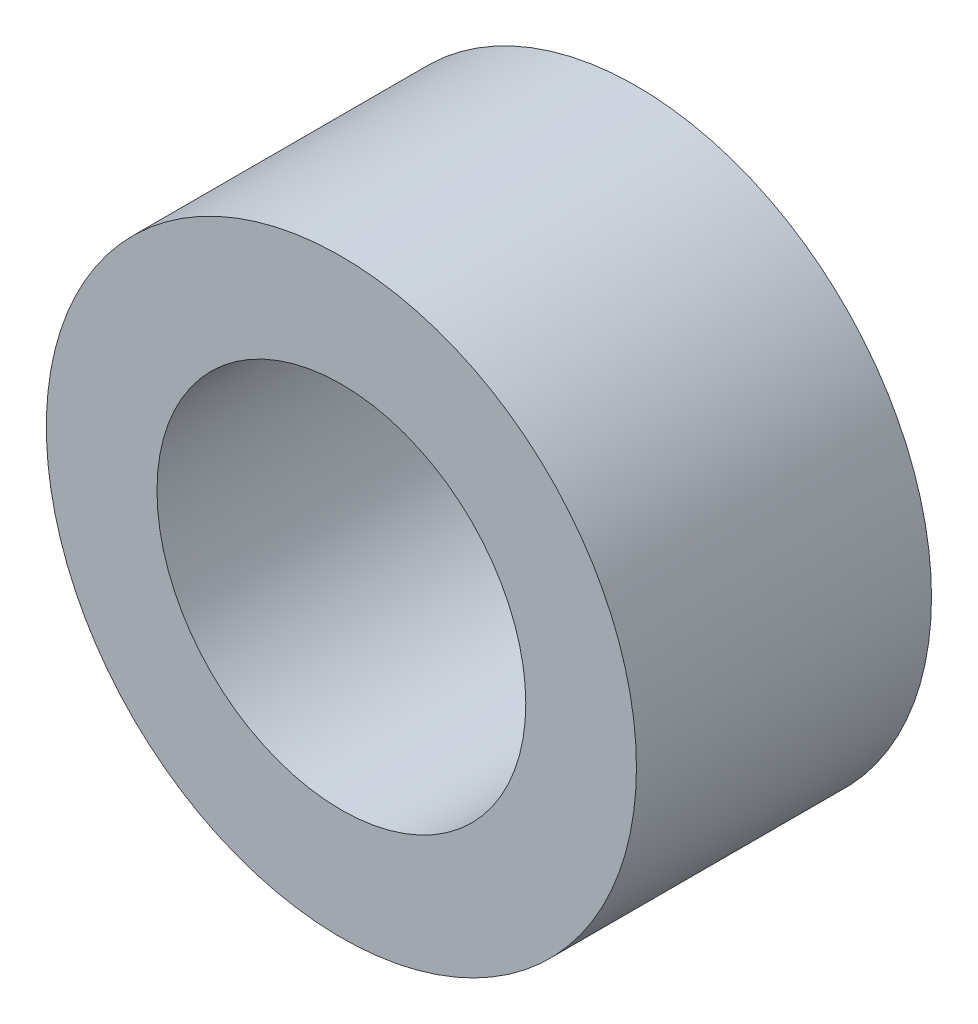
ISO-10303-21;
HEADER;
FILE_DESCRIPTION(('STEP AP214'),'2;1');
FILE_NAME('part.step','',(''),(''),'','','');
FILE_SCHEMA(('AUTOMOTIVE_DESIGN { 1 0 10303 214 1 1 1 1 }'));
ENDSEC;
DATA;
#1=APPLICATION_CONTEXT('core data for automotive mechanical design processes');
#2=APPLICATION_PROTOCOL_DEFINITION('international standard','automotive_design',2000,#1);
#3=PRODUCT_CONTEXT('',#1,'mechanical');
#4=PRODUCT('Part','Part','',(#3));
#5=PRODUCT_RELATED_PRODUCT_CATEGORY('part','',(#4));
#6=PRODUCT_DEFINITION_FORMATION('','',#4);
#7=PRODUCT_DEFINITION_CONTEXT('part definition',#1,'design');
#8=PRODUCT_DEFINITION('design','',#6,#7);
#9=PRODUCT_DEFINITION_SHAPE('','',#8);
#10=(LENGTH_UNIT() NAMED_UNIT(*) SI_UNIT(.MILLI.,.METRE.));
#11=(NAMED_UNIT(*) PLANE_ANGLE_UNIT() SI_UNIT($,.RADIAN.));
#12=(NAMED_UNIT(*) SI_UNIT($,.STERADIAN.) SOLID_ANGLE_UNIT());
#13=UNCERTAINTY_MEASURE_WITH_UNIT(LENGTH_MEASURE(1.E-05),#10,'distance_accuracy_value','');
#14=(GEOMETRIC_REPRESENTATION_CONTEXT(3) GLOBAL_UNCERTAINTY_ASSIGNED_CONTEXT((#13)) GLOBAL_UNIT_ASSIGNED_CONTEXT((#10,
#11,#12)) REPRESENTATION_CONTEXT('',''));
#15=CARTESIAN_POINT('',(0.,0.,0.));
#16=DIRECTION('',(0.,0.,1.));
#17=DIRECTION('',(1.,0.,0.));
#18=AXIS2_PLACEMENT_3D('',#15,#16,#17);
#19=CARTESIAN_POINT('',(0.,0.,5.));
#20=DIRECTION('',(0.,0.,1.));
#21=DIRECTION('',(1.,0.,0.));
#22=AXIS2_PLACEMENT_3D('',#19,#20,#21);
#23=PLANE('',#22);
#24=CARTESIAN_POINT('',(0.,0.,5.));
#25=DIRECTION('',(0.,0.,1.));
#26=DIRECTION('',(1.,0.,0.));
#27=AXIS2_PLACEMENT_3D('',#24,#25,#26);
#28=CIRCLE('',#27,5.);
#29=CARTESIAN_POINT('',(5.,0.,5.));
#30=VERTEX_POINT('',#29);
#31=EDGE_CURVE('E10',#30,#30,#28,.T.);
#32=ORIENTED_EDGE('',*,*,#31,.T.);
#33=EDGE_LOOP('',(#32));
#34=FACE_BOUND('',#33,.T.);
#35=CARTESIAN_POINT('',(0.,0.,5.));
#36=DIRECTION('',(0.,0.,1.));
#37=DIRECTION('',(1.,0.,0.));
#38=AXIS2_PLACEMENT_3D('',#35,#36,#37);
#39=CIRCLE('',#38,3.125);
#40=CARTESIAN_POINT('',(3.125,0.,5.));
#41=VERTEX_POINT('',#40);
#42=EDGE_CURVE('E42',#41,#41,#39,.T.);
#43=ORIENTED_EDGE('',*,*,#42,.F.);
#44=EDGE_LOOP('',(#43));
#45=FACE_BOUND('',#44,.T.);
#46=ADVANCED_FACE('F31',(#34,#45),#23,.T.);
#47=CARTESIAN_POINT('',(0.,0.,0.));
#48=DIRECTION('',(0.,0.,1.));
#49=DIRECTION('',(1.,0.,0.));
#50=AXIS2_PLACEMENT_3D('',#47,#48,#49);
#51=PLANE('',#50);
#52=CARTESIAN_POINT('',(0.,0.,0.));
#53=DIRECTION('',(0.,0.,1.));
#54=DIRECTION('',(1.,0.,0.));
#55=AXIS2_PLACEMENT_3D('',#52,#53,#54);
#56=CIRCLE('',#55,5.);
#57=CARTESIAN_POINT('',(5.,0.,0.));
#58=VERTEX_POINT('',#57);
#59=EDGE_CURVE('E35',#58,#58,#56,.T.);
#60=ORIENTED_EDGE('',*,*,#59,.F.);
#61=EDGE_LOOP('',(#60));
#62=FACE_BOUND('',#61,.T.);
#63=CARTESIAN_POINT('',(0.,0.,0.));
#64=DIRECTION('',(0.,0.,1.));
#65=DIRECTION('',(1.,0.,0.));
#66=AXIS2_PLACEMENT_3D('',#63,#64,#65);
#67=CIRCLE('',#66,3.125);
#68=CARTESIAN_POINT('',(3.125,0.,0.));
#69=VERTEX_POINT('',#68);
#70=EDGE_CURVE('E44',#69,#69,#67,.T.);
#71=ORIENTED_EDGE('',*,*,#70,.T.);
#72=EDGE_LOOP('',(#71));
#73=FACE_BOUND('',#72,.T.);
#74=ADVANCED_FACE('F54',(#62,#73),#51,.F.);
#75=CARTESIAN_POINT('',(0.,0.,5.));
#76=DIRECTION('',(0.,0.,-1.));
#77=DIRECTION('',(-1.,0.,0.));
#78=AXIS2_PLACEMENT_3D('',#75,#76,#77);
#79=CYLINDRICAL_SURFACE('',#78,5.);
#80=ORIENTED_EDGE('',*,*,#31,.F.);
#81=EDGE_LOOP('',(#80));
#82=FACE_BOUND('',#81,.T.);
#83=ORIENTED_EDGE('',*,*,#59,.T.);
#84=EDGE_LOOP('',(#83));
#85=FACE_BOUND('',#84,.T.);
#86=ADVANCED_FACE('F33',(#82,#85),#79,.T.);
#87=CARTESIAN_POINT('',(0.,0.,5.));
#88=DIRECTION('',(0.,0.,-1.));
#89=DIRECTION('',(-1.,0.,0.));
#90=AXIS2_PLACEMENT_3D('',#87,#88,#89);
#91=CYLINDRICAL_SURFACE('',#90,3.125);
#92=ORIENTED_EDGE('',*,*,#42,.T.);
#93=EDGE_LOOP('',(#92));
#94=FACE_BOUND('',#93,.T.);
#95=ORIENTED_EDGE('',*,*,#70,.F.);
#96=EDGE_LOOP('',(#95));
#97=FACE_BOUND('',#96,.T.);
#98=ADVANCED_FACE('F50',(#94,#97),#91,.F.);
#99=CLOSED_SHELL('',(#46,#74,#86,#98));
#100=MANIFOLD_SOLID_BREP('B2',#99);
#101=ADVANCED_BREP_SHAPE_REPRESENTATION('',(#18,#100),#14);
#102=SHAPE_DEFINITION_REPRESENTATION(#9,#101);
ENDSEC;
END-ISO-10303-21;
